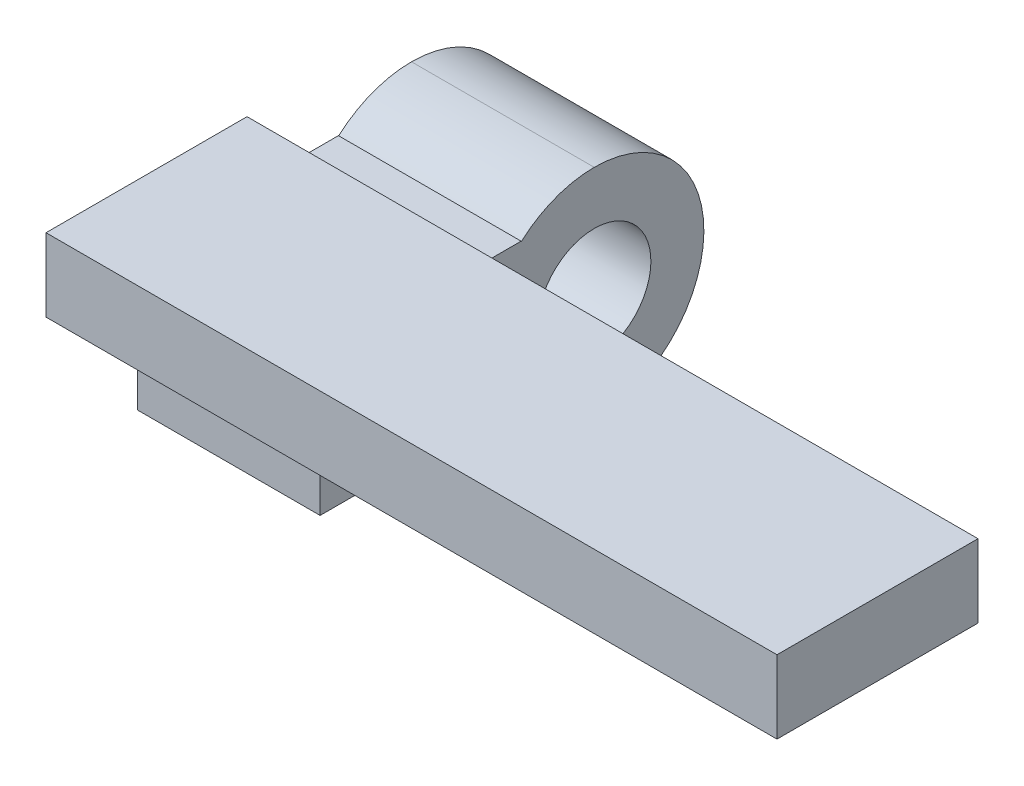
ISO-10303-21;
HEADER;
FILE_DESCRIPTION(('STEP AP214'),'2;1');
FILE_NAME('part.step','',(''),(''),'','','');
FILE_SCHEMA(('AUTOMOTIVE_DESIGN { 1 0 10303 214 1 1 1 1 }'));
ENDSEC;
DATA;
#1=APPLICATION_CONTEXT('core data for automotive mechanical design processes');
#2=APPLICATION_PROTOCOL_DEFINITION('international standard','automotive_design',2000,#1);
#3=PRODUCT_CONTEXT('',#1,'mechanical');
#4=PRODUCT('Part','Part','',(#3));
#5=PRODUCT_RELATED_PRODUCT_CATEGORY('part','',(#4));
#6=PRODUCT_DEFINITION_FORMATION('','',#4);
#7=PRODUCT_DEFINITION_CONTEXT('part definition',#1,'design');
#8=PRODUCT_DEFINITION('design','',#6,#7);
#9=PRODUCT_DEFINITION_SHAPE('','',#8);
#10=(LENGTH_UNIT() NAMED_UNIT(*) SI_UNIT(.MILLI.,.METRE.));
#11=(NAMED_UNIT(*) PLANE_ANGLE_UNIT() SI_UNIT($,.RADIAN.));
#12=(NAMED_UNIT(*) SI_UNIT($,.STERADIAN.) SOLID_ANGLE_UNIT());
#13=UNCERTAINTY_MEASURE_WITH_UNIT(LENGTH_MEASURE(1.E-05),#10,'distance_accuracy_value','');
#14=(GEOMETRIC_REPRESENTATION_CONTEXT(3) GLOBAL_UNCERTAINTY_ASSIGNED_CONTEXT((#13)) GLOBAL_UNIT_ASSIGNED_CONTEXT((#10,
#11,#12)) REPRESENTATION_CONTEXT('',''));
#15=CARTESIAN_POINT('',(0.,0.,0.));
#16=DIRECTION('',(0.,0.,1.));
#17=DIRECTION('',(1.,0.,0.));
#18=AXIS2_PLACEMENT_3D('',#15,#16,#17);
#19=CARTESIAN_POINT('',(5.,3.09999999995634,-1.6452256718729E-05));
#20=DIRECTION('',(-1.,0.,0.));
#21=DIRECTION('',(0.,0.,1.));
#22=AXIS2_PLACEMENT_3D('',#19,#20,#21);
#23=PLANE('',#22);
#24=DIRECTION('',(0.,1.,0.));
#25=VECTOR('',#24,1.);
#26=CARTESIAN_POINT('',(5.,3.09999999995634,9.));
#27=LINE('',#26,#25);
#28=CARTESIAN_POINT('',(5.,3.9,9.));
#29=VERTEX_POINT('',#28);
#30=CARTESIAN_POINT('',(5.,4.5,9.));
#31=VERTEX_POINT('',#30);
#32=EDGE_CURVE('E57',#29,#31,#27,.T.);
#33=ORIENTED_EDGE('',*,*,#32,.F.);
#34=DIRECTION('',(0.,0.,-1.));
#35=VECTOR('',#34,1.);
#36=CARTESIAN_POINT('',(5.,3.9,-1.6452256718729E-05));
#37=LINE('',#36,#35);
#38=CARTESIAN_POINT('',(5.,3.9,15.));
#39=VERTEX_POINT('',#38);
#40=EDGE_CURVE('E169',#39,#29,#37,.T.);
#41=ORIENTED_EDGE('',*,*,#40,.F.);
#42=DIRECTION('',(0.,-1.,0.));
#43=VECTOR('',#42,1.);
#44=CARTESIAN_POINT('',(5.,4.5,15.));
#45=LINE('',#44,#43);
#46=CARTESIAN_POINT('',(5.,-3.,15.));
#47=VERTEX_POINT('',#46);
#48=EDGE_CURVE('E197',#39,#47,#45,.T.);
#49=ORIENTED_EDGE('',*,*,#48,.T.);
#50=DIRECTION('',(0.,0.,-1.));
#51=VECTOR('',#50,1.);
#52=CARTESIAN_POINT('',(5.,-3.,15.));
#53=LINE('',#52,#51);
#54=CARTESIAN_POINT('',(5.,-3.,5.19615242270663));
#55=VERTEX_POINT('',#54);
#56=EDGE_CURVE('E176',#47,#55,#53,.T.);
#57=ORIENTED_EDGE('',*,*,#56,.T.);
#58=CARTESIAN_POINT('',(5.,0.,0.));
#59=DIRECTION('',(-1.,0.,0.));
#60=DIRECTION('',(0.,0.,1.));
#61=AXIS2_PLACEMENT_3D('',#58,#59,#60);
#62=CIRCLE('',#61,6.);
#63=CARTESIAN_POINT('',(5.,5.9999999999155,-3.18430775201207E-05));
#64=VERTEX_POINT('',#63);
#65=EDGE_CURVE('E227',#64,#55,#62,.T.);
#66=ORIENTED_EDGE('',*,*,#65,.F.);
#67=DIRECTION('',(0.,0.999999999985917,-5.30717958668678E-06));
#68=VECTOR('',#67,1.);
#69=CARTESIAN_POINT('',(5.,3.09999999995634,-1.6452256718729E-05));
#70=LINE('',#69,#68);
#71=CARTESIAN_POINT('',(5.,3.09999999995634,-1.6452256718729E-05));
#72=VERTEX_POINT('',#71);
#73=EDGE_CURVE('E217',#72,#64,#70,.T.);
#74=ORIENTED_EDGE('',*,*,#73,.F.);
#75=CARTESIAN_POINT('',(5.,0.,0.));
#76=DIRECTION('',(-1.,0.,0.));
#77=DIRECTION('',(0.,0.,1.));
#78=AXIS2_PLACEMENT_3D('',#75,#76,#77);
#79=CIRCLE('',#78,3.1);
#80=CARTESIAN_POINT('',(5.,3.1,0.));
#81=VERTEX_POINT('',#80);
#82=EDGE_CURVE('E229',#72,#81,#79,.T.);
#83=ORIENTED_EDGE('',*,*,#82,.T.);
#84=DIRECTION('',(0.,1.,0.));
#85=VECTOR('',#84,1.);
#86=CARTESIAN_POINT('',(5.,3.1,0.));
#87=LINE('',#86,#85);
#88=CARTESIAN_POINT('',(5.,6.,0.));
#89=VERTEX_POINT('',#88);
#90=EDGE_CURVE('E210',#81,#89,#87,.T.);
#91=ORIENTED_EDGE('',*,*,#90,.T.);
#92=CARTESIAN_POINT('',(5.,4.47213595499958,4.));
#93=VERTEX_POINT('',#92);
#94=EDGE_CURVE('E230',#93,#89,#62,.T.);
#95=ORIENTED_EDGE('',*,*,#94,.F.);
#96=DIRECTION('',(0.,-1.,0.));
#97=VECTOR('',#96,1.);
#98=CARTESIAN_POINT('',(5.,4.5,4.));
#99=LINE('',#98,#97);
#100=CARTESIAN_POINT('',(5.,4.5,4.));
#101=VERTEX_POINT('',#100);
#102=EDGE_CURVE('E195',#101,#93,#99,.T.);
#103=ORIENTED_EDGE('',*,*,#102,.F.);
#104=DIRECTION('',(0.,0.,-1.));
#105=VECTOR('',#104,1.);
#106=CARTESIAN_POINT('',(5.,4.5,15.));
#107=LINE('',#106,#105);
#108=EDGE_CURVE('E180',#31,#101,#107,.T.);
#109=ORIENTED_EDGE('',*,*,#108,.F.);
#110=EDGE_LOOP('',(#33,#41,#49,#57,#66,#74,#83,#91,#95,#103,#109));
#111=FACE_BOUND('',#110,.T.);
#112=ADVANCED_FACE('F41',(#111),#23,.F.);
#113=CARTESIAN_POINT('',(-5.,4.5,15.));
#114=DIRECTION('',(0.,0.,-1.));
#115=DIRECTION('',(-1.,0.,0.));
#116=AXIS2_PLACEMENT_3D('',#113,#114,#115);
#117=PLANE('',#116);
#118=DIRECTION('',(1.,0.,0.));
#119=VECTOR('',#118,1.);
#120=CARTESIAN_POINT('',(-5.,3.9,15.));
#121=LINE('',#120,#119);
#122=CARTESIAN_POINT('',(-5.,3.9,15.));
#123=VERTEX_POINT('',#122);
#124=EDGE_CURVE('E11',#123,#39,#121,.T.);
#125=ORIENTED_EDGE('',*,*,#124,.F.);
#126=DIRECTION('',(0.,-1.,0.));
#127=VECTOR('',#126,1.);
#128=CARTESIAN_POINT('',(-5.,4.5,15.));
#129=LINE('',#128,#127);
#130=CARTESIAN_POINT('',(-5.,-3.,15.));
#131=VERTEX_POINT('',#130);
#132=EDGE_CURVE('E200',#123,#131,#129,.T.);
#133=ORIENTED_EDGE('',*,*,#132,.T.);
#134=DIRECTION('',(1.,0.,0.));
#135=VECTOR('',#134,1.);
#136=CARTESIAN_POINT('',(-5.,-3.,15.));
#137=LINE('',#136,#135);
#138=EDGE_CURVE('E190',#131,#47,#137,.T.);
#139=ORIENTED_EDGE('',*,*,#138,.T.);
#140=ORIENTED_EDGE('',*,*,#48,.F.);
#141=EDGE_LOOP('',(#125,#133,#139,#140));
#142=FACE_BOUND('',#141,.T.);
#143=ADVANCED_FACE('F278',(#142),#117,.F.);
#144=CARTESIAN_POINT('',(0.,4.5,0.));
#145=DIRECTION('',(0.,1.,0.));
#146=DIRECTION('',(0.,0.,1.));
#147=AXIS2_PLACEMENT_3D('',#144,#145,#146);
#148=PLANE('',#147);
#149=DIRECTION('',(0.,0.,1.));
#150=VECTOR('',#149,1.);
#151=CARTESIAN_POINT('',(-5.,4.5,4.));
#152=LINE('',#151,#150);
#153=CARTESIAN_POINT('',(-5.,4.5,4.));
#154=VERTEX_POINT('',#153);
#155=CARTESIAN_POINT('',(-5.,4.5,9.));
#156=VERTEX_POINT('',#155);
#157=EDGE_CURVE('E178',#154,#156,#152,.T.);
#158=ORIENTED_EDGE('',*,*,#157,.T.);
#159=DIRECTION('',(1.,0.,0.));
#160=VECTOR('',#159,1.);
#161=CARTESIAN_POINT('',(0.,4.5,9.));
#162=LINE('',#161,#160);
#163=EDGE_CURVE('E47',#156,#31,#162,.T.);
#164=ORIENTED_EDGE('',*,*,#163,.T.);
#165=ORIENTED_EDGE('',*,*,#108,.T.);
#166=DIRECTION('',(-1.,0.,0.));
#167=VECTOR('',#166,1.);
#168=CARTESIAN_POINT('',(5.,4.5,4.));
#169=LINE('',#168,#167);
#170=EDGE_CURVE('E185',#101,#154,#169,.T.);
#171=ORIENTED_EDGE('',*,*,#170,.T.);
#172=EDGE_LOOP('',(#158,#164,#165,#171));
#173=FACE_BOUND('',#172,.T.);
#174=ADVANCED_FACE('F238',(#173),#148,.T.);
#175=CARTESIAN_POINT('',(-5.,0.,0.));
#176=DIRECTION('',(-1.,0.,0.));
#177=DIRECTION('',(0.,0.,1.));
#178=AXIS2_PLACEMENT_3D('',#175,#176,#177);
#179=CYLINDRICAL_SURFACE('',#178,6.);
#180=DIRECTION('',(-1.,0.,0.));
#181=VECTOR('',#180,1.);
#182=CARTESIAN_POINT('',(-5.,4.47213595499958,4.));
#183=LINE('',#182,#181);
#184=CARTESIAN_POINT('',(-5.,4.47213595499958,4.));
#185=VERTEX_POINT('',#184);
#186=EDGE_CURVE('E240',#93,#185,#183,.T.);
#187=ORIENTED_EDGE('',*,*,#186,.F.);
#188=ORIENTED_EDGE('',*,*,#94,.T.);
#189=DIRECTION('',(-1.,0.,0.));
#190=VECTOR('',#189,1.);
#191=CARTESIAN_POINT('',(5.,6.,0.));
#192=LINE('',#191,#190);
#193=CARTESIAN_POINT('',(-5.,6.,0.));
#194=VERTEX_POINT('',#193);
#195=EDGE_CURVE('E209',#89,#194,#192,.T.);
#196=ORIENTED_EDGE('',*,*,#195,.T.);
#197=CARTESIAN_POINT('',(-5.,0.,0.));
#198=DIRECTION('',(-1.,0.,0.));
#199=DIRECTION('',(0.,0.,1.));
#200=AXIS2_PLACEMENT_3D('',#197,#198,#199);
#201=CIRCLE('',#200,6.);
#202=EDGE_CURVE('E63',#185,#194,#201,.T.);
#203=ORIENTED_EDGE('',*,*,#202,.F.);
#204=EDGE_LOOP('',(#187,#188,#196,#203));
#205=FACE_BOUND('',#204,.T.);
#206=ADVANCED_FACE('F287',(#205),#179,.T.);
#207=DIRECTION('',(-1.,0.,0.));
#208=VECTOR('',#207,1.);
#209=CARTESIAN_POINT('',(-5.,-3.,5.19615242270663));
#210=LINE('',#209,#208);
#211=CARTESIAN_POINT('',(-5.,-3.,5.19615242270663));
#212=VERTEX_POINT('',#211);
#213=EDGE_CURVE('E235',#212,#55,#210,.F.);
#214=ORIENTED_EDGE('',*,*,#213,.F.);
#215=CARTESIAN_POINT('',(-5.,5.9999999999155,-3.18430775201207E-05));
#216=VERTEX_POINT('',#215);
#217=EDGE_CURVE('E221',#216,#212,#201,.T.);
#218=ORIENTED_EDGE('',*,*,#217,.F.);
#219=DIRECTION('',(-1.,0.,0.));
#220=VECTOR('',#219,1.);
#221=CARTESIAN_POINT('',(5.,5.9999999999155,-3.18430775201207E-05));
#222=LINE('',#221,#220);
#223=EDGE_CURVE('E222',#64,#216,#222,.T.);
#224=ORIENTED_EDGE('',*,*,#223,.F.);
#225=ORIENTED_EDGE('',*,*,#65,.T.);
#226=EDGE_LOOP('',(#214,#218,#224,#225));
#227=FACE_BOUND('',#226,.T.);
#228=ADVANCED_FACE('F292',(#227),#179,.T.);
#229=CARTESIAN_POINT('',(-5.,5.9999999999155,-3.18430775201207E-05));
#230=DIRECTION('',(1.,0.,0.));
#231=DIRECTION('',(0.,0.,-1.));
#232=AXIS2_PLACEMENT_3D('',#229,#230,#231);
#233=PLANE('',#232);
#234=ORIENTED_EDGE('',*,*,#132,.F.);
#235=DIRECTION('',(0.,0.,1.));
#236=VECTOR('',#235,1.);
#237=CARTESIAN_POINT('',(-5.,3.9,9.));
#238=LINE('',#237,#236);
#239=CARTESIAN_POINT('',(-5.,3.9,20.));
#240=VERTEX_POINT('',#239);
#241=EDGE_CURVE('E164',#123,#240,#238,.T.);
#242=ORIENTED_EDGE('',*,*,#241,.T.);
#243=DIRECTION('',(0.,-1.,0.));
#244=VECTOR('',#243,1.);
#245=CARTESIAN_POINT('',(-5.,7.9,20.));
#246=LINE('',#245,#244);
#247=CARTESIAN_POINT('',(-5.,7.9,20.));
#248=VERTEX_POINT('',#247);
#249=EDGE_CURVE('E148',#248,#240,#246,.T.);
#250=ORIENTED_EDGE('',*,*,#249,.F.);
#251=DIRECTION('',(0.,0.,1.));
#252=VECTOR('',#251,1.);
#253=CARTESIAN_POINT('',(-5.,7.9,9.));
#254=LINE('',#253,#252);
#255=CARTESIAN_POINT('',(-5.,7.9,9.));
#256=VERTEX_POINT('',#255);
#257=EDGE_CURVE('E155',#256,#248,#254,.T.);
#258=ORIENTED_EDGE('',*,*,#257,.F.);
#259=DIRECTION('',(0.,-1.,0.));
#260=VECTOR('',#259,1.);
#261=CARTESIAN_POINT('',(-5.,7.9,9.));
#262=LINE('',#261,#260);
#263=EDGE_CURVE('E246',#256,#156,#262,.T.);
#264=ORIENTED_EDGE('',*,*,#263,.T.);
#265=ORIENTED_EDGE('',*,*,#157,.F.);
#266=DIRECTION('',(0.,-1.,0.));
#267=VECTOR('',#266,1.);
#268=CARTESIAN_POINT('',(-5.,4.5,4.));
#269=LINE('',#268,#267);
#270=EDGE_CURVE('E184',#154,#185,#269,.T.);
#271=ORIENTED_EDGE('',*,*,#270,.T.);
#272=ORIENTED_EDGE('',*,*,#202,.T.);
#273=DIRECTION('',(0.,-1.,0.));
#274=VECTOR('',#273,1.);
#275=CARTESIAN_POINT('',(-5.,6.,0.));
#276=LINE('',#275,#274);
#277=CARTESIAN_POINT('',(-5.,3.1,0.));
#278=VERTEX_POINT('',#277);
#279=EDGE_CURVE('E203',#194,#278,#276,.T.);
#280=ORIENTED_EDGE('',*,*,#279,.T.);
#281=CARTESIAN_POINT('',(-5.,0.,0.));
#282=DIRECTION('',(-1.,0.,0.));
#283=DIRECTION('',(0.,0.,1.));
#284=AXIS2_PLACEMENT_3D('',#281,#282,#283);
#285=CIRCLE('',#284,3.1);
#286=CARTESIAN_POINT('',(-5.,3.09999999995634,-1.6452256718729E-05));
#287=VERTEX_POINT('',#286);
#288=EDGE_CURVE('E234',#287,#278,#285,.T.);
#289=ORIENTED_EDGE('',*,*,#288,.F.);
#290=DIRECTION('',(0.,-0.999999999985917,5.30717958668678E-06));
#291=VECTOR('',#290,1.);
#292=CARTESIAN_POINT('',(-5.,5.9999999999155,-3.18430775201207E-05));
#293=LINE('',#292,#291);
#294=EDGE_CURVE('E215',#216,#287,#293,.T.);
#295=ORIENTED_EDGE('',*,*,#294,.F.);
#296=ORIENTED_EDGE('',*,*,#217,.T.);
#297=DIRECTION('',(0.,0.,1.));
#298=VECTOR('',#297,1.);
#299=CARTESIAN_POINT('',(-5.,-3.,4.));
#300=LINE('',#299,#298);
#301=EDGE_CURVE('E174',#212,#131,#300,.T.);
#302=ORIENTED_EDGE('',*,*,#301,.T.);
#303=EDGE_LOOP('',(#234,#242,#250,#258,#264,#265,#271,#272,#280,#289,#295,#296,#302));
#304=FACE_BOUND('',#303,.T.);
#305=ADVANCED_FACE('F163',(#304),#233,.F.);
#306=CARTESIAN_POINT('',(-5.,0.,0.));
#307=DIRECTION('',(-1.,0.,0.));
#308=DIRECTION('',(0.,0.,1.));
#309=AXIS2_PLACEMENT_3D('',#306,#307,#308);
#310=CYLINDRICAL_SURFACE('',#309,3.1);
#311=ORIENTED_EDGE('',*,*,#82,.F.);
#312=DIRECTION('',(1.,0.,0.));
#313=VECTOR('',#312,1.);
#314=CARTESIAN_POINT('',(-5.,3.09999999995634,-1.6452256718729E-05));
#315=LINE('',#314,#313);
#316=EDGE_CURVE('E214',#287,#72,#315,.T.);
#317=ORIENTED_EDGE('',*,*,#316,.F.);
#318=ORIENTED_EDGE('',*,*,#288,.T.);
#319=DIRECTION('',(1.,0.,0.));
#320=VECTOR('',#319,1.);
#321=CARTESIAN_POINT('',(-5.,3.1,0.));
#322=LINE('',#321,#320);
#323=EDGE_CURVE('E204',#278,#81,#322,.T.);
#324=ORIENTED_EDGE('',*,*,#323,.T.);
#325=EDGE_LOOP('',(#311,#317,#318,#324));
#326=FACE_BOUND('',#325,.T.);
#327=ADVANCED_FACE('F43',(#326),#310,.F.);
#328=CARTESIAN_POINT('',(0.,0.,0.));
#329=DIRECTION('',(0.,5.30717958668678E-06,0.999999999985917));
#330=DIRECTION('',(1.,0.,0.));
#331=AXIS2_PLACEMENT_3D('',#328,#329,#330);
#332=PLANE('',#331);
#333=ORIENTED_EDGE('',*,*,#294,.T.);
#334=ORIENTED_EDGE('',*,*,#316,.T.);
#335=ORIENTED_EDGE('',*,*,#73,.T.);
#336=ORIENTED_EDGE('',*,*,#223,.T.);
#337=EDGE_LOOP('',(#333,#334,#335,#336));
#338=FACE_BOUND('',#337,.T.);
#339=ADVANCED_FACE('F294',(#338),#332,.T.);
#340=CARTESIAN_POINT('',(0.,0.,0.));
#341=DIRECTION('',(0.,0.,1.));
#342=DIRECTION('',(1.,0.,0.));
#343=AXIS2_PLACEMENT_3D('',#340,#341,#342);
#344=PLANE('',#343);
#345=ORIENTED_EDGE('',*,*,#279,.F.);
#346=ORIENTED_EDGE('',*,*,#195,.F.);
#347=ORIENTED_EDGE('',*,*,#90,.F.);
#348=ORIENTED_EDGE('',*,*,#323,.F.);
#349=EDGE_LOOP('',(#345,#346,#347,#348));
#350=FACE_BOUND('',#349,.T.);
#351=ADVANCED_FACE('F300',(#350),#344,.F.);
#352=CARTESIAN_POINT('',(5.,4.5,4.));
#353=DIRECTION('',(0.,0.,1.));
#354=DIRECTION('',(1.,0.,0.));
#355=AXIS2_PLACEMENT_3D('',#352,#353,#354);
#356=PLANE('',#355);
#357=ORIENTED_EDGE('',*,*,#102,.T.);
#358=ORIENTED_EDGE('',*,*,#186,.T.);
#359=ORIENTED_EDGE('',*,*,#270,.F.);
#360=ORIENTED_EDGE('',*,*,#170,.F.);
#361=EDGE_LOOP('',(#357,#358,#359,#360));
#362=FACE_BOUND('',#361,.T.);
#363=ADVANCED_FACE('F250',(#362),#356,.F.);
#364=CARTESIAN_POINT('',(0.,-3.,0.));
#365=DIRECTION('',(0.,1.,0.));
#366=DIRECTION('',(0.,0.,1.));
#367=AXIS2_PLACEMENT_3D('',#364,#365,#366);
#368=PLANE('',#367);
#369=ORIENTED_EDGE('',*,*,#301,.F.);
#370=ORIENTED_EDGE('',*,*,#213,.T.);
#371=ORIENTED_EDGE('',*,*,#56,.F.);
#372=ORIENTED_EDGE('',*,*,#138,.F.);
#373=EDGE_LOOP('',(#369,#370,#371,#372));
#374=FACE_BOUND('',#373,.T.);
#375=ADVANCED_FACE('F274',(#374),#368,.F.);
#376=CARTESIAN_POINT('',(0.,3.9,0.));
#377=DIRECTION('',(0.,1.,0.));
#378=DIRECTION('',(0.,0.,1.));
#379=AXIS2_PLACEMENT_3D('',#376,#377,#378);
#380=PLANE('',#379);
#381=ORIENTED_EDGE('',*,*,#124,.T.);
#382=ORIENTED_EDGE('',*,*,#40,.T.);
#383=DIRECTION('',(-1.,0.,0.));
#384=VECTOR('',#383,1.);
#385=CARTESIAN_POINT('',(35.,3.9,9.));
#386=LINE('',#385,#384);
#387=CARTESIAN_POINT('',(35.,3.9,9.));
#388=VERTEX_POINT('',#387);
#389=EDGE_CURVE('E161',#388,#29,#386,.T.);
#390=ORIENTED_EDGE('',*,*,#389,.F.);
#391=DIRECTION('',(0.,0.,-1.));
#392=VECTOR('',#391,1.);
#393=CARTESIAN_POINT('',(35.,3.9,20.));
#394=LINE('',#393,#392);
#395=CARTESIAN_POINT('',(35.,3.9,20.));
#396=VERTEX_POINT('',#395);
#397=EDGE_CURVE('E258',#396,#388,#394,.T.);
#398=ORIENTED_EDGE('',*,*,#397,.F.);
#399=DIRECTION('',(1.,0.,0.));
#400=VECTOR('',#399,1.);
#401=CARTESIAN_POINT('',(-5.,3.9,20.));
#402=LINE('',#401,#400);
#403=EDGE_CURVE('E256',#240,#396,#402,.T.);
#404=ORIENTED_EDGE('',*,*,#403,.F.);
#405=ORIENTED_EDGE('',*,*,#241,.F.);
#406=EDGE_LOOP('',(#381,#382,#390,#398,#404,#405));
#407=FACE_BOUND('',#406,.T.);
#408=ADVANCED_FACE('F268',(#407),#380,.F.);
#409=CARTESIAN_POINT('',(35.,7.9,9.));
#410=DIRECTION('',(0.,0.,1.));
#411=DIRECTION('',(1.,0.,0.));
#412=AXIS2_PLACEMENT_3D('',#409,#410,#411);
#413=PLANE('',#412);
#414=ORIENTED_EDGE('',*,*,#389,.T.);
#415=ORIENTED_EDGE('',*,*,#32,.T.);
#416=ORIENTED_EDGE('',*,*,#163,.F.);
#417=ORIENTED_EDGE('',*,*,#263,.F.);
#418=DIRECTION('',(-1.,0.,0.));
#419=VECTOR('',#418,1.);
#420=CARTESIAN_POINT('',(35.,7.9,9.));
#421=LINE('',#420,#419);
#422=CARTESIAN_POINT('',(35.,7.9,9.));
#423=VERTEX_POINT('',#422);
#424=EDGE_CURVE('E160',#423,#256,#421,.T.);
#425=ORIENTED_EDGE('',*,*,#424,.F.);
#426=DIRECTION('',(0.,-1.,0.));
#427=VECTOR('',#426,1.);
#428=CARTESIAN_POINT('',(35.,7.9,9.));
#429=LINE('',#428,#427);
#430=EDGE_CURVE('E168',#423,#388,#429,.T.);
#431=ORIENTED_EDGE('',*,*,#430,.T.);
#432=EDGE_LOOP('',(#414,#415,#416,#417,#425,#431));
#433=FACE_BOUND('',#432,.T.);
#434=ADVANCED_FACE('F266',(#433),#413,.F.);
#435=CARTESIAN_POINT('',(-5.,7.9,20.));
#436=DIRECTION('',(0.,0.,-1.));
#437=DIRECTION('',(-1.,0.,0.));
#438=AXIS2_PLACEMENT_3D('',#435,#436,#437);
#439=PLANE('',#438);
#440=ORIENTED_EDGE('',*,*,#403,.T.);
#441=DIRECTION('',(0.,-1.,0.));
#442=VECTOR('',#441,1.);
#443=CARTESIAN_POINT('',(35.,7.9,20.));
#444=LINE('',#443,#442);
#445=CARTESIAN_POINT('',(35.,7.9,20.));
#446=VERTEX_POINT('',#445);
#447=EDGE_CURVE('E146',#446,#396,#444,.T.);
#448=ORIENTED_EDGE('',*,*,#447,.F.);
#449=DIRECTION('',(1.,0.,0.));
#450=VECTOR('',#449,1.);
#451=CARTESIAN_POINT('',(-5.,7.9,20.));
#452=LINE('',#451,#450);
#453=EDGE_CURVE('E142',#248,#446,#452,.T.);
#454=ORIENTED_EDGE('',*,*,#453,.F.);
#455=ORIENTED_EDGE('',*,*,#249,.T.);
#456=EDGE_LOOP('',(#440,#448,#454,#455));
#457=FACE_BOUND('',#456,.T.);
#458=ADVANCED_FACE('F145',(#457),#439,.F.);
#459=CARTESIAN_POINT('',(35.,7.9,20.));
#460=DIRECTION('',(-1.,0.,0.));
#461=DIRECTION('',(0.,0.,1.));
#462=AXIS2_PLACEMENT_3D('',#459,#460,#461);
#463=PLANE('',#462);
#464=ORIENTED_EDGE('',*,*,#397,.T.);
#465=ORIENTED_EDGE('',*,*,#430,.F.);
#466=DIRECTION('',(0.,0.,-1.));
#467=VECTOR('',#466,1.);
#468=CARTESIAN_POINT('',(35.,7.9,20.));
#469=LINE('',#468,#467);
#470=EDGE_CURVE('E151',#446,#423,#469,.T.);
#471=ORIENTED_EDGE('',*,*,#470,.F.);
#472=ORIENTED_EDGE('',*,*,#447,.T.);
#473=EDGE_LOOP('',(#464,#465,#471,#472));
#474=FACE_BOUND('',#473,.T.);
#475=ADVANCED_FACE('F263',(#474),#463,.F.);
#476=CARTESIAN_POINT('',(0.,7.9,0.));
#477=DIRECTION('',(0.,1.,0.));
#478=DIRECTION('',(0.,0.,1.));
#479=AXIS2_PLACEMENT_3D('',#476,#477,#478);
#480=PLANE('',#479);
#481=ORIENTED_EDGE('',*,*,#257,.T.);
#482=ORIENTED_EDGE('',*,*,#453,.T.);
#483=ORIENTED_EDGE('',*,*,#470,.T.);
#484=ORIENTED_EDGE('',*,*,#424,.T.);
#485=EDGE_LOOP('',(#481,#482,#483,#484));
#486=FACE_BOUND('',#485,.T.);
#487=ADVANCED_FACE('F154',(#486),#480,.T.);
#488=CLOSED_SHELL('',(#112,#143,#174,#206,#228,#305,#327,#339,#351,#363,#375,#408,#434,#458,
#475,#487));
#489=MANIFOLD_SOLID_BREP('B2',#488);
#490=ADVANCED_BREP_SHAPE_REPRESENTATION('',(#18,#489),#14);
#491=SHAPE_DEFINITION_REPRESENTATION(#9,#490);
ENDSEC;
END-ISO-10303-21;
